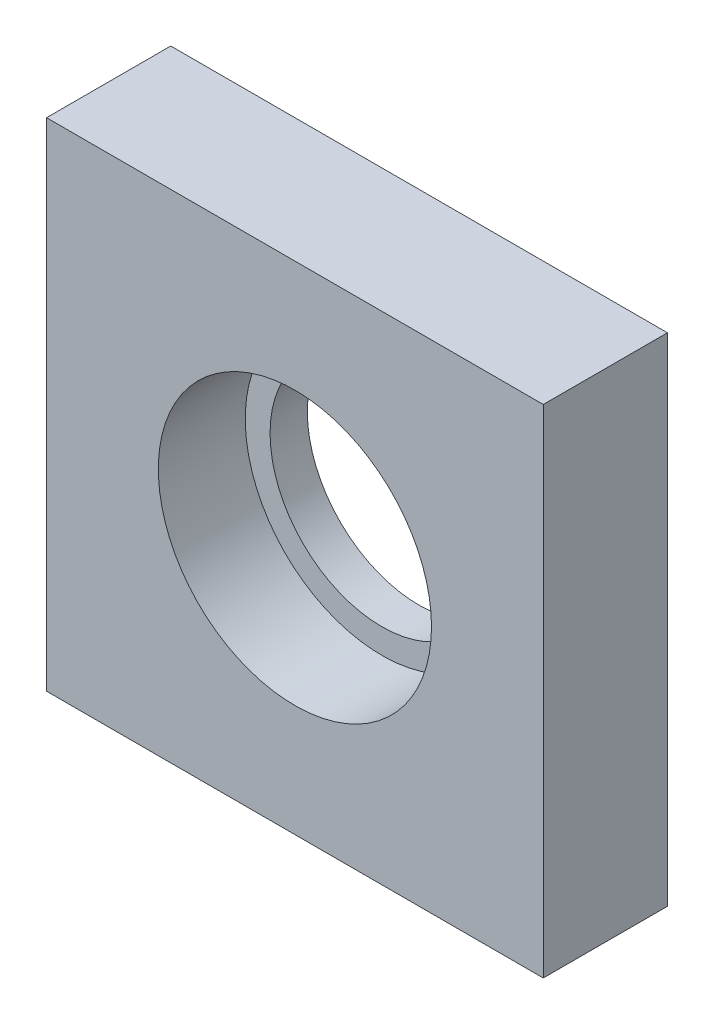
ISO-10303-21;
HEADER;
FILE_DESCRIPTION(('STEP AP214'),'2;1');
FILE_NAME('part.step','',(''),(''),'','','');
FILE_SCHEMA(('AUTOMOTIVE_DESIGN { 1 0 10303 214 1 1 1 1 }'));
ENDSEC;
DATA;
#1=APPLICATION_CONTEXT('core data for automotive mechanical design processes');
#2=APPLICATION_PROTOCOL_DEFINITION('international standard','automotive_design',2000,#1);
#3=PRODUCT_CONTEXT('',#1,'mechanical');
#4=PRODUCT('Part','Part','',(#3));
#5=PRODUCT_RELATED_PRODUCT_CATEGORY('part','',(#4));
#6=PRODUCT_DEFINITION_FORMATION('','',#4);
#7=PRODUCT_DEFINITION_CONTEXT('part definition',#1,'design');
#8=PRODUCT_DEFINITION('design','',#6,#7);
#9=PRODUCT_DEFINITION_SHAPE('','',#8);
#10=(LENGTH_UNIT() NAMED_UNIT(*) SI_UNIT(.MILLI.,.METRE.));
#11=(NAMED_UNIT(*) PLANE_ANGLE_UNIT() SI_UNIT($,.RADIAN.));
#12=(NAMED_UNIT(*) SI_UNIT($,.STERADIAN.) SOLID_ANGLE_UNIT());
#13=UNCERTAINTY_MEASURE_WITH_UNIT(LENGTH_MEASURE(1.E-05),#10,'distance_accuracy_value','');
#14=(GEOMETRIC_REPRESENTATION_CONTEXT(3) GLOBAL_UNCERTAINTY_ASSIGNED_CONTEXT((#13)) GLOBAL_UNIT_ASSIGNED_CONTEXT((#10,
#11,#12)) REPRESENTATION_CONTEXT('',''));
#15=CARTESIAN_POINT('',(0.,0.,0.));
#16=DIRECTION('',(0.,0.,1.));
#17=DIRECTION('',(1.,0.,0.));
#18=AXIS2_PLACEMENT_3D('',#15,#16,#17);
#19=CARTESIAN_POINT('',(-22.3606797749979,-20.,10.));
#20=DIRECTION('',(0.,1.,0.));
#21=DIRECTION('',(0.,0.,1.));
#22=AXIS2_PLACEMENT_3D('',#19,#20,#21);
#23=PLANE('',#22);
#24=CARTESIAN_POINT('',(-15.,-20.,5.));
#25=DIRECTION('',(0.,-1.,0.));
#26=DIRECTION('',(0.,0.,-1.));
#27=AXIS2_PLACEMENT_3D('',#24,#25,#26);
#28=CIRCLE('',#27,1.64999999999999);
#29=CARTESIAN_POINT('',(-15.,-20.,3.35000000000001));
#30=VERTEX_POINT('',#29);
#31=EDGE_CURVE('E93',#30,#30,#28,.T.);
#32=ORIENTED_EDGE('',*,*,#31,.F.);
#33=EDGE_LOOP('',(#32));
#34=FACE_BOUND('',#33,.T.);
#35=CARTESIAN_POINT('',(15.,-20.,5.));
#36=DIRECTION('',(0.,-1.,0.));
#37=DIRECTION('',(0.,0.,-1.));
#38=AXIS2_PLACEMENT_3D('',#35,#36,#37);
#39=CIRCLE('',#38,1.64999999999999);
#40=CARTESIAN_POINT('',(15.,-20.,3.35000000000001));
#41=VERTEX_POINT('',#40);
#42=EDGE_CURVE('E96',#41,#41,#39,.T.);
#43=ORIENTED_EDGE('',*,*,#42,.F.);
#44=EDGE_LOOP('',(#43));
#45=FACE_BOUND('',#44,.T.);
#46=DIRECTION('',(0.,0.,1.));
#47=VECTOR('',#46,1.);
#48=CARTESIAN_POINT('',(20.,-20.,0.));
#49=LINE('',#48,#47);
#50=CARTESIAN_POINT('',(20.,-20.,0.));
#51=VERTEX_POINT('',#50);
#52=CARTESIAN_POINT('',(20.,-20.,10.));
#53=VERTEX_POINT('',#52);
#54=EDGE_CURVE('E118',#51,#53,#49,.T.);
#55=ORIENTED_EDGE('',*,*,#54,.T.);
#56=DIRECTION('',(1.,0.,0.));
#57=VECTOR('',#56,1.);
#58=CARTESIAN_POINT('',(-22.3606797749979,-20.,10.));
#59=LINE('',#58,#57);
#60=CARTESIAN_POINT('',(-20.,-20.,10.));
#61=VERTEX_POINT('',#60);
#62=EDGE_CURVE('E12',#61,#53,#59,.T.);
#63=ORIENTED_EDGE('',*,*,#62,.F.);
#64=DIRECTION('',(0.,0.,1.));
#65=VECTOR('',#64,1.);
#66=CARTESIAN_POINT('',(-20.,-20.,0.));
#67=LINE('',#66,#65);
#68=CARTESIAN_POINT('',(-20.,-20.,0.));
#69=VERTEX_POINT('',#68);
#70=EDGE_CURVE('E122',#69,#61,#67,.T.);
#71=ORIENTED_EDGE('',*,*,#70,.F.);
#72=DIRECTION('',(1.,0.,0.));
#73=VECTOR('',#72,1.);
#74=CARTESIAN_POINT('',(-22.3606797749979,-20.,0.));
#75=LINE('',#74,#73);
#76=EDGE_CURVE('E45',#69,#51,#75,.T.);
#77=ORIENTED_EDGE('',*,*,#76,.T.);
#78=EDGE_LOOP('',(#55,#63,#71,#77));
#79=FACE_BOUND('',#78,.T.);
#80=ADVANCED_FACE('F37',(#34,#45,#79),#23,.F.);
#81=CARTESIAN_POINT('',(0.,0.,10.));
#82=DIRECTION('',(0.,0.,1.));
#83=DIRECTION('',(1.,0.,0.));
#84=AXIS2_PLACEMENT_3D('',#81,#82,#83);
#85=PLANE('',#84);
#86=CARTESIAN_POINT('',(0.,0.,10.));
#87=DIRECTION('',(0.,0.,1.));
#88=DIRECTION('',(1.,0.,0.));
#89=AXIS2_PLACEMENT_3D('',#86,#87,#88);
#90=CIRCLE('',#89,11.);
#91=CARTESIAN_POINT('',(11.,0.,10.));
#92=VERTEX_POINT('',#91);
#93=EDGE_CURVE('E128',#92,#92,#90,.T.);
#94=ORIENTED_EDGE('',*,*,#93,.F.);
#95=EDGE_LOOP('',(#94));
#96=FACE_BOUND('',#95,.T.);
#97=ORIENTED_EDGE('',*,*,#62,.T.);
#98=DIRECTION('',(0.,1.,0.));
#99=VECTOR('',#98,1.);
#100=CARTESIAN_POINT('',(20.,-20.,10.));
#101=LINE('',#100,#99);
#102=CARTESIAN_POINT('',(20.,20.,10.));
#103=VERTEX_POINT('',#102);
#104=EDGE_CURVE('E103',#53,#103,#101,.T.);
#105=ORIENTED_EDGE('',*,*,#104,.T.);
#106=DIRECTION('',(-1.,0.,0.));
#107=VECTOR('',#106,1.);
#108=CARTESIAN_POINT('',(20.,20.,10.));
#109=LINE('',#108,#107);
#110=CARTESIAN_POINT('',(-20.,20.,10.));
#111=VERTEX_POINT('',#110);
#112=EDGE_CURVE('E106',#103,#111,#109,.T.);
#113=ORIENTED_EDGE('',*,*,#112,.T.);
#114=DIRECTION('',(0.,-1.,0.));
#115=VECTOR('',#114,1.);
#116=CARTESIAN_POINT('',(-20.,-20.,10.));
#117=LINE('',#116,#115);
#118=EDGE_CURVE('E109',#111,#61,#117,.T.);
#119=ORIENTED_EDGE('',*,*,#118,.T.);
#120=EDGE_LOOP('',(#97,#105,#113,#119));
#121=FACE_BOUND('',#120,.T.);
#122=ADVANCED_FACE('F148',(#96,#121),#85,.T.);
#123=CARTESIAN_POINT('',(0.,0.,0.));
#124=DIRECTION('',(0.,0.,1.));
#125=DIRECTION('',(1.,0.,0.));
#126=AXIS2_PLACEMENT_3D('',#123,#124,#125);
#127=PLANE('',#126);
#128=CARTESIAN_POINT('',(0.,0.,0.));
#129=DIRECTION('',(0.,0.,-1.));
#130=DIRECTION('',(-1.,0.,0.));
#131=AXIS2_PLACEMENT_3D('',#128,#129,#130);
#132=CIRCLE('',#131,9.);
#133=CARTESIAN_POINT('',(-9.,0.,0.));
#134=VERTEX_POINT('',#133);
#135=EDGE_CURVE('E121',#134,#134,#132,.T.);
#136=ORIENTED_EDGE('',*,*,#135,.F.);
#137=EDGE_LOOP('',(#136));
#138=FACE_BOUND('',#137,.T.);
#139=DIRECTION('',(0.,1.,0.));
#140=VECTOR('',#139,1.);
#141=CARTESIAN_POINT('',(20.,-20.,0.));
#142=LINE('',#141,#140);
#143=CARTESIAN_POINT('',(20.,20.,0.));
#144=VERTEX_POINT('',#143);
#145=EDGE_CURVE('E52',#51,#144,#142,.T.);
#146=ORIENTED_EDGE('',*,*,#145,.F.);
#147=ORIENTED_EDGE('',*,*,#76,.F.);
#148=DIRECTION('',(0.,-1.,0.));
#149=VECTOR('',#148,1.);
#150=CARTESIAN_POINT('',(-20.,-20.,0.));
#151=LINE('',#150,#149);
#152=CARTESIAN_POINT('',(-20.,20.,0.));
#153=VERTEX_POINT('',#152);
#154=EDGE_CURVE('E115',#153,#69,#151,.T.);
#155=ORIENTED_EDGE('',*,*,#154,.F.);
#156=DIRECTION('',(-1.,0.,0.));
#157=VECTOR('',#156,1.);
#158=CARTESIAN_POINT('',(20.,20.,0.));
#159=LINE('',#158,#157);
#160=EDGE_CURVE('E113',#144,#153,#159,.T.);
#161=ORIENTED_EDGE('',*,*,#160,.F.);
#162=EDGE_LOOP('',(#146,#147,#155,#161));
#163=FACE_BOUND('',#162,.T.);
#164=ADVANCED_FACE('F141',(#138,#163),#127,.F.);
#165=CARTESIAN_POINT('',(0.,0.,3.));
#166=DIRECTION('',(0.,0.,1.));
#167=DIRECTION('',(1.,0.,0.));
#168=AXIS2_PLACEMENT_3D('',#165,#166,#167);
#169=CYLINDRICAL_SURFACE('',#168,11.);
#170=CARTESIAN_POINT('',(0.,0.,3.));
#171=DIRECTION('',(0.,0.,1.));
#172=DIRECTION('',(1.,0.,0.));
#173=AXIS2_PLACEMENT_3D('',#170,#171,#172);
#174=CIRCLE('',#173,11.);
#175=CARTESIAN_POINT('',(11.,0.,3.));
#176=VERTEX_POINT('',#175);
#177=EDGE_CURVE('E131',#176,#176,#174,.T.);
#178=ORIENTED_EDGE('',*,*,#177,.F.);
#179=EDGE_LOOP('',(#178));
#180=FACE_BOUND('',#179,.T.);
#181=ORIENTED_EDGE('',*,*,#93,.T.);
#182=EDGE_LOOP('',(#181));
#183=FACE_BOUND('',#182,.T.);
#184=ADVANCED_FACE('F236',(#180,#183),#169,.F.);
#185=CARTESIAN_POINT('',(0.,0.,3.));
#186=DIRECTION('',(0.,0.,1.));
#187=DIRECTION('',(1.,0.,0.));
#188=AXIS2_PLACEMENT_3D('',#185,#186,#187);
#189=PLANE('',#188);
#190=CARTESIAN_POINT('',(0.,0.,3.));
#191=DIRECTION('',(0.,0.,1.));
#192=DIRECTION('',(1.,0.,0.));
#193=AXIS2_PLACEMENT_3D('',#190,#191,#192);
#194=CIRCLE('',#193,9.);
#195=CARTESIAN_POINT('',(9.,0.,3.));
#196=VERTEX_POINT('',#195);
#197=EDGE_CURVE('E40',#196,#196,#194,.T.);
#198=ORIENTED_EDGE('',*,*,#197,.F.);
#199=EDGE_LOOP('',(#198));
#200=FACE_BOUND('',#199,.T.);
#201=ORIENTED_EDGE('',*,*,#177,.T.);
#202=EDGE_LOOP('',(#201));
#203=FACE_BOUND('',#202,.T.);
#204=ADVANCED_FACE('F244',(#200,#203),#189,.T.);
#205=CARTESIAN_POINT('',(0.,0.,10.));
#206=DIRECTION('',(0.,0.,-1.));
#207=DIRECTION('',(-1.,0.,0.));
#208=AXIS2_PLACEMENT_3D('',#205,#206,#207);
#209=CYLINDRICAL_SURFACE('',#208,9.);
#210=ORIENTED_EDGE('',*,*,#197,.T.);
#211=EDGE_LOOP('',(#210));
#212=FACE_BOUND('',#211,.T.);
#213=ORIENTED_EDGE('',*,*,#135,.T.);
#214=EDGE_LOOP('',(#213));
#215=FACE_BOUND('',#214,.T.);
#216=ADVANCED_FACE('F158',(#212,#215),#209,.F.);
#217=CARTESIAN_POINT('',(20.,-20.,0.));
#218=DIRECTION('',(1.,0.,0.));
#219=DIRECTION('',(0.,0.,-1.));
#220=AXIS2_PLACEMENT_3D('',#217,#218,#219);
#221=PLANE('',#220);
#222=ORIENTED_EDGE('',*,*,#104,.F.);
#223=ORIENTED_EDGE('',*,*,#54,.F.);
#224=ORIENTED_EDGE('',*,*,#145,.T.);
#225=DIRECTION('',(0.,0.,1.));
#226=VECTOR('',#225,1.);
#227=CARTESIAN_POINT('',(20.,20.,0.));
#228=LINE('',#227,#226);
#229=EDGE_CURVE('E117',#144,#103,#228,.T.);
#230=ORIENTED_EDGE('',*,*,#229,.T.);
#231=EDGE_LOOP('',(#222,#223,#224,#230));
#232=FACE_BOUND('',#231,.T.);
#233=ADVANCED_FACE('F146',(#232),#221,.T.);
#234=CARTESIAN_POINT('',(-20.,-20.,0.));
#235=DIRECTION('',(-1.,0.,0.));
#236=DIRECTION('',(0.,-1.,0.));
#237=AXIS2_PLACEMENT_3D('',#234,#235,#236);
#238=PLANE('',#237);
#239=ORIENTED_EDGE('',*,*,#118,.F.);
#240=DIRECTION('',(0.,0.,1.));
#241=VECTOR('',#240,1.);
#242=CARTESIAN_POINT('',(-20.,20.,0.));
#243=LINE('',#242,#241);
#244=EDGE_CURVE('E60',#153,#111,#243,.T.);
#245=ORIENTED_EDGE('',*,*,#244,.F.);
#246=ORIENTED_EDGE('',*,*,#154,.T.);
#247=ORIENTED_EDGE('',*,*,#70,.T.);
#248=EDGE_LOOP('',(#239,#245,#246,#247));
#249=FACE_BOUND('',#248,.T.);
#250=ADVANCED_FACE('F149',(#249),#238,.T.);
#251=CARTESIAN_POINT('',(20.,20.,0.));
#252=DIRECTION('',(0.,1.,0.));
#253=DIRECTION('',(-1.,0.,0.));
#254=AXIS2_PLACEMENT_3D('',#251,#252,#253);
#255=PLANE('',#254);
#256=ORIENTED_EDGE('',*,*,#112,.F.);
#257=ORIENTED_EDGE('',*,*,#229,.F.);
#258=ORIENTED_EDGE('',*,*,#160,.T.);
#259=ORIENTED_EDGE('',*,*,#244,.T.);
#260=EDGE_LOOP('',(#256,#257,#258,#259));
#261=FACE_BOUND('',#260,.T.);
#262=ADVANCED_FACE('F145',(#261),#255,.T.);
#263=CARTESIAN_POINT('',(15.,-20.,5.));
#264=DIRECTION('',(0.,-1.,0.));
#265=DIRECTION('',(0.,0.,-1.));
#266=AXIS2_PLACEMENT_3D('',#263,#264,#265);
#267=CYLINDRICAL_SURFACE('',#266,1.64999999999999);
#268=CARTESIAN_POINT('',(15.,9.99999999999999,5.));
#269=DIRECTION('',(0.,-1.,0.));
#270=DIRECTION('',(0.,0.,-1.));
#271=AXIS2_PLACEMENT_3D('',#268,#269,#270);
#272=CIRCLE('',#271,1.64999999999999);
#273=CARTESIAN_POINT('',(15.,9.99999999999999,3.35000000000001));
#274=VERTEX_POINT('',#273);
#275=EDGE_CURVE('E92',#274,#274,#272,.T.);
#276=ORIENTED_EDGE('',*,*,#275,.F.);
#277=EDGE_LOOP('',(#276));
#278=FACE_BOUND('',#277,.T.);
#279=ORIENTED_EDGE('',*,*,#42,.T.);
#280=EDGE_LOOP('',(#279));
#281=FACE_BOUND('',#280,.T.);
#282=ADVANCED_FACE('F156',(#278,#281),#267,.F.);
#283=CARTESIAN_POINT('',(15.,9.99999999999999,5.));
#284=DIRECTION('',(0.,-1.,0.));
#285=DIRECTION('',(0.,0.,-1.));
#286=AXIS2_PLACEMENT_3D('',#283,#284,#285);
#287=CONICAL_SURFACE('',#286,1.64999999999999,1.02974425867665);
#288=CARTESIAN_POINT('',(15.,10.9914200213955,5.));
#289=VERTEX_POINT('',#288);
#290=VERTEX_LOOP('',#289);
#291=FACE_BOUND('',#290,.T.);
#292=ORIENTED_EDGE('',*,*,#275,.T.);
#293=EDGE_LOOP('',(#292));
#294=FACE_BOUND('',#293,.T.);
#295=ADVANCED_FACE('F87',(#291,#294),#287,.F.);
#296=CARTESIAN_POINT('',(-15.,-20.,5.));
#297=DIRECTION('',(0.,-1.,0.));
#298=DIRECTION('',(0.,0.,-1.));
#299=AXIS2_PLACEMENT_3D('',#296,#297,#298);
#300=CYLINDRICAL_SURFACE('',#299,1.64999999999999);
#301=CARTESIAN_POINT('',(-15.,9.99999999999999,5.));
#302=DIRECTION('',(0.,-1.,0.));
#303=DIRECTION('',(0.,0.,-1.));
#304=AXIS2_PLACEMENT_3D('',#301,#302,#303);
#305=CIRCLE('',#304,1.64999999999999);
#306=CARTESIAN_POINT('',(-15.,9.99999999999999,3.35000000000001));
#307=VERTEX_POINT('',#306);
#308=EDGE_CURVE('E90',#307,#307,#305,.T.);
#309=ORIENTED_EDGE('',*,*,#308,.F.);
#310=EDGE_LOOP('',(#309));
#311=FACE_BOUND('',#310,.T.);
#312=ORIENTED_EDGE('',*,*,#31,.T.);
#313=EDGE_LOOP('',(#312));
#314=FACE_BOUND('',#313,.T.);
#315=ADVANCED_FACE('F85',(#311,#314),#300,.F.);
#316=CARTESIAN_POINT('',(-15.,9.99999999999999,5.));
#317=DIRECTION('',(0.,-1.,0.));
#318=DIRECTION('',(0.,0.,-1.));
#319=AXIS2_PLACEMENT_3D('',#316,#317,#318);
#320=CONICAL_SURFACE('',#319,1.64999999999999,1.02974425867665);
#321=CARTESIAN_POINT('',(-15.,10.9914200213955,5.));
#322=VERTEX_POINT('',#321);
#323=VERTEX_LOOP('',#322);
#324=FACE_BOUND('',#323,.T.);
#325=ORIENTED_EDGE('',*,*,#308,.T.);
#326=EDGE_LOOP('',(#325));
#327=FACE_BOUND('',#326,.T.);
#328=ADVANCED_FACE('F82',(#324,#327),#320,.F.);
#329=CLOSED_SHELL('',(#80,#122,#164,#184,#204,#216,#233,#250,#262,#282,#295,#315,#328));
#330=MANIFOLD_SOLID_BREP('B2',#329);
#331=ADVANCED_BREP_SHAPE_REPRESENTATION('',(#18,#330),#14);
#332=SHAPE_DEFINITION_REPRESENTATION(#9,#331);
ENDSEC;
END-ISO-10303-21;
